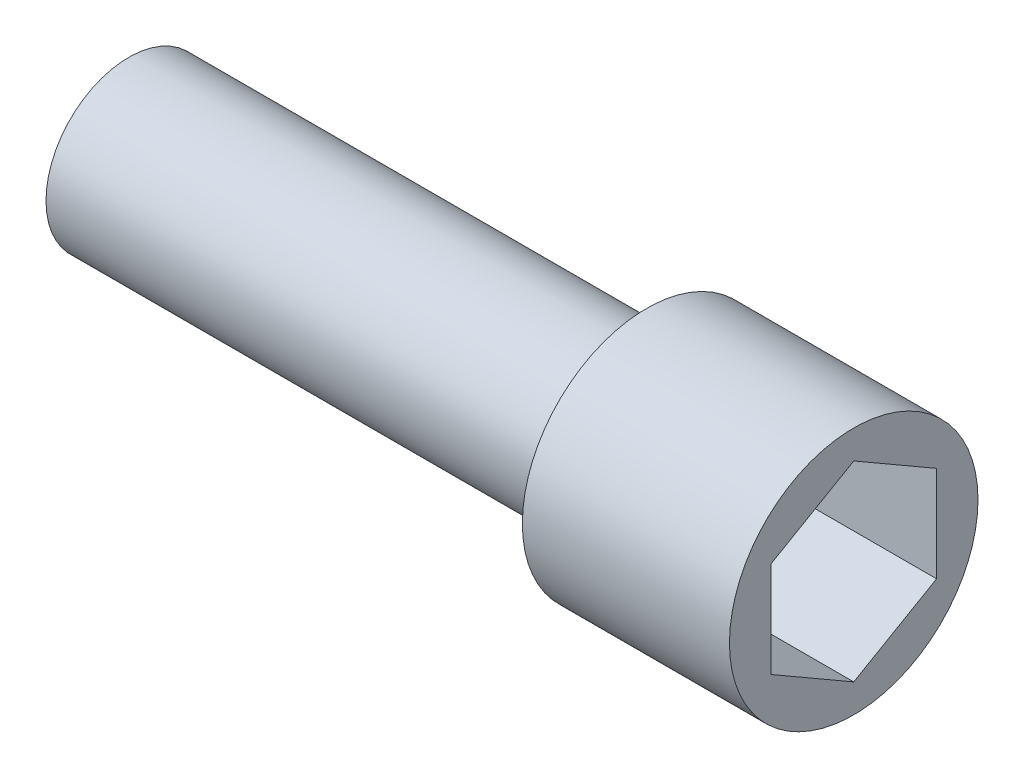
ISO-10303-21;
HEADER;
FILE_DESCRIPTION(('STEP AP214'),'2;1');
FILE_NAME('part.step','',(''),(''),'','','');
FILE_SCHEMA(('AUTOMOTIVE_DESIGN { 1 0 10303 214 1 1 1 1 }'));
ENDSEC;
DATA;
#1=APPLICATION_CONTEXT('core data for automotive mechanical design processes');
#2=APPLICATION_PROTOCOL_DEFINITION('international standard','automotive_design',2000,#1);
#3=PRODUCT_CONTEXT('',#1,'mechanical');
#4=PRODUCT('Part','Part','',(#3));
#5=PRODUCT_RELATED_PRODUCT_CATEGORY('part','',(#4));
#6=PRODUCT_DEFINITION_FORMATION('','',#4);
#7=PRODUCT_DEFINITION_CONTEXT('part definition',#1,'design');
#8=PRODUCT_DEFINITION('design','',#6,#7);
#9=PRODUCT_DEFINITION_SHAPE('','',#8);
#10=(LENGTH_UNIT() NAMED_UNIT(*) SI_UNIT(.MILLI.,.METRE.));
#11=(NAMED_UNIT(*) PLANE_ANGLE_UNIT() SI_UNIT($,.RADIAN.));
#12=(NAMED_UNIT(*) SI_UNIT($,.STERADIAN.) SOLID_ANGLE_UNIT());
#13=UNCERTAINTY_MEASURE_WITH_UNIT(LENGTH_MEASURE(1.E-05),#10,'distance_accuracy_value','');
#14=(GEOMETRIC_REPRESENTATION_CONTEXT(3) GLOBAL_UNCERTAINTY_ASSIGNED_CONTEXT((#13)) GLOBAL_UNIT_ASSIGNED_CONTEXT((#10,
#11,#12)) REPRESENTATION_CONTEXT('',''));
#15=CARTESIAN_POINT('',(0.,0.,0.));
#16=DIRECTION('',(0.,0.,1.));
#17=DIRECTION('',(1.,0.,0.));
#18=AXIS2_PLACEMENT_3D('',#15,#16,#17);
#19=CARTESIAN_POINT('',(10.,0.,0.));
#20=DIRECTION('',(-1.,0.,0.));
#21=DIRECTION('',(0.,0.,1.));
#22=AXIS2_PLACEMENT_3D('',#19,#20,#21);
#23=CYLINDRICAL_SURFACE('',#22,6.);
#24=CARTESIAN_POINT('',(10.,0.,0.));
#25=DIRECTION('',(1.,0.,0.));
#26=DIRECTION('',(0.,0.,-1.));
#27=AXIS2_PLACEMENT_3D('',#24,#25,#26);
#28=CIRCLE('',#27,6.);
#29=CARTESIAN_POINT('',(10.,0.,-6.));
#30=VERTEX_POINT('',#29);
#31=EDGE_CURVE('E54',#30,#30,#28,.T.);
#32=ORIENTED_EDGE('',*,*,#31,.F.);
#33=EDGE_LOOP('',(#32));
#34=FACE_BOUND('',#33,.T.);
#35=CARTESIAN_POINT('',(0.,0.,0.));
#36=DIRECTION('',(1.,0.,0.));
#37=DIRECTION('',(0.,0.,-1.));
#38=AXIS2_PLACEMENT_3D('',#35,#36,#37);
#39=CIRCLE('',#38,6.);
#40=CARTESIAN_POINT('',(0.,0.,-6.));
#41=VERTEX_POINT('',#40);
#42=EDGE_CURVE('E48',#41,#41,#39,.T.);
#43=ORIENTED_EDGE('',*,*,#42,.T.);
#44=EDGE_LOOP('',(#43));
#45=FACE_BOUND('',#44,.T.);
#46=ADVANCED_FACE('F45',(#34,#45),#23,.T.);
#47=CARTESIAN_POINT('',(10.,0.,0.));
#48=DIRECTION('',(1.,0.,0.));
#49=DIRECTION('',(0.,0.,-1.));
#50=AXIS2_PLACEMENT_3D('',#47,#48,#49);
#51=PLANE('',#50);
#52=DIRECTION('',(0.,0.5,0.866025403784439));
#53=VECTOR('',#52,1.);
#54=CARTESIAN_POINT('',(10.,2.3094010767585,-4.));
#55=LINE('',#54,#53);
#56=CARTESIAN_POINT('',(10.,2.3094010767585,-4.));
#57=VERTEX_POINT('',#56);
#58=CARTESIAN_POINT('',(10.,4.61880215351701,0.));
#59=VERTEX_POINT('',#58);
#60=EDGE_CURVE('E62',#57,#59,#55,.T.);
#61=ORIENTED_EDGE('',*,*,#60,.F.);
#62=DIRECTION('',(0.,1.,0.));
#63=VECTOR('',#62,1.);
#64=CARTESIAN_POINT('',(10.,-2.3094010767585,-4.));
#65=LINE('',#64,#63);
#66=CARTESIAN_POINT('',(10.,-2.3094010767585,-4.));
#67=VERTEX_POINT('',#66);
#68=EDGE_CURVE('E156',#67,#57,#65,.T.);
#69=ORIENTED_EDGE('',*,*,#68,.F.);
#70=DIRECTION('',(0.,0.5,-0.866025403784438));
#71=VECTOR('',#70,1.);
#72=CARTESIAN_POINT('',(10.,-4.61880215351701,0.));
#73=LINE('',#72,#71);
#74=CARTESIAN_POINT('',(10.,-4.61880215351701,0.));
#75=VERTEX_POINT('',#74);
#76=EDGE_CURVE('E153',#75,#67,#73,.T.);
#77=ORIENTED_EDGE('',*,*,#76,.F.);
#78=DIRECTION('',(0.,-0.5,-0.866025403784439));
#79=VECTOR('',#78,1.);
#80=CARTESIAN_POINT('',(10.,-2.3094010767585,4.));
#81=LINE('',#80,#79);
#82=CARTESIAN_POINT('',(10.,-2.3094010767585,4.));
#83=VERTEX_POINT('',#82);
#84=EDGE_CURVE('E110',#83,#75,#81,.T.);
#85=ORIENTED_EDGE('',*,*,#84,.F.);
#86=DIRECTION('',(0.,-1.,0.));
#87=VECTOR('',#86,1.);
#88=CARTESIAN_POINT('',(10.,2.3094010767585,4.));
#89=LINE('',#88,#87);
#90=CARTESIAN_POINT('',(10.,2.3094010767585,4.));
#91=VERTEX_POINT('',#90);
#92=EDGE_CURVE('E147',#91,#83,#89,.T.);
#93=ORIENTED_EDGE('',*,*,#92,.F.);
#94=DIRECTION('',(0.,-0.5,0.866025403784438));
#95=VECTOR('',#94,1.);
#96=CARTESIAN_POINT('',(10.,4.61880215351701,0.));
#97=LINE('',#96,#95);
#98=EDGE_CURVE('E142',#59,#91,#97,.T.);
#99=ORIENTED_EDGE('',*,*,#98,.F.);
#100=EDGE_LOOP('',(#61,#69,#77,#85,#93,#99));
#101=FACE_BOUND('',#100,.T.);
#102=ORIENTED_EDGE('',*,*,#31,.T.);
#103=EDGE_LOOP('',(#102));
#104=FACE_BOUND('',#103,.T.);
#105=ADVANCED_FACE('F182',(#101,#104),#51,.T.);
#106=CARTESIAN_POINT('',(0.,0.,0.));
#107=DIRECTION('',(1.,0.,0.));
#108=DIRECTION('',(0.,0.,-1.));
#109=AXIS2_PLACEMENT_3D('',#106,#107,#108);
#110=PLANE('',#109);
#111=CARTESIAN_POINT('',(0.,0.,0.));
#112=DIRECTION('',(-1.,0.,0.));
#113=DIRECTION('',(0.,0.,1.));
#114=AXIS2_PLACEMENT_3D('',#111,#112,#113);
#115=CIRCLE('',#114,4.);
#116=CARTESIAN_POINT('',(0.,0.,4.));
#117=VERTEX_POINT('',#116);
#118=EDGE_CURVE('E11',#117,#117,#115,.T.);
#119=ORIENTED_EDGE('',*,*,#118,.F.);
#120=EDGE_LOOP('',(#119));
#121=FACE_BOUND('',#120,.T.);
#122=ORIENTED_EDGE('',*,*,#42,.F.);
#123=EDGE_LOOP('',(#122));
#124=FACE_BOUND('',#123,.T.);
#125=ADVANCED_FACE('F179',(#121,#124),#110,.F.);
#126=CARTESIAN_POINT('',(3.,2.3094010767585,-4.));
#127=DIRECTION('',(0.,0.866025403784439,-0.5));
#128=DIRECTION('',(0.,0.5,0.866025403784439));
#129=AXIS2_PLACEMENT_3D('',#126,#127,#128);
#130=PLANE('',#129);
#131=ORIENTED_EDGE('',*,*,#60,.T.);
#132=DIRECTION('',(1.,0.,0.));
#133=VECTOR('',#132,1.);
#134=CARTESIAN_POINT('',(3.,4.61880215351701,0.));
#135=LINE('',#134,#133);
#136=CARTESIAN_POINT('',(3.,4.61880215351701,0.));
#137=VERTEX_POINT('',#136);
#138=EDGE_CURVE('E92',#137,#59,#135,.T.);
#139=ORIENTED_EDGE('',*,*,#138,.F.);
#140=DIRECTION('',(0.,0.5,0.866025403784439));
#141=VECTOR('',#140,1.);
#142=CARTESIAN_POINT('',(3.,2.3094010767585,-4.));
#143=LINE('',#142,#141);
#144=CARTESIAN_POINT('',(3.,2.3094010767585,-4.));
#145=VERTEX_POINT('',#144);
#146=EDGE_CURVE('E159',#145,#137,#143,.T.);
#147=ORIENTED_EDGE('',*,*,#146,.F.);
#148=DIRECTION('',(1.,0.,0.));
#149=VECTOR('',#148,1.);
#150=CARTESIAN_POINT('',(3.,2.3094010767585,-4.));
#151=LINE('',#150,#149);
#152=EDGE_CURVE('E70',#145,#57,#151,.T.);
#153=ORIENTED_EDGE('',*,*,#152,.T.);
#154=EDGE_LOOP('',(#131,#139,#147,#153));
#155=FACE_BOUND('',#154,.T.);
#156=ADVANCED_FACE('F181',(#155),#130,.F.);
#157=CARTESIAN_POINT('',(3.,-2.3094010767585,-4.));
#158=DIRECTION('',(0.,0.,-1.));
#159=DIRECTION('',(-1.,0.,0.));
#160=AXIS2_PLACEMENT_3D('',#157,#158,#159);
#161=PLANE('',#160);
#162=ORIENTED_EDGE('',*,*,#68,.T.);
#163=ORIENTED_EDGE('',*,*,#152,.F.);
#164=DIRECTION('',(0.,1.,0.));
#165=VECTOR('',#164,1.);
#166=CARTESIAN_POINT('',(3.,-2.3094010767585,-4.));
#167=LINE('',#166,#165);
#168=CARTESIAN_POINT('',(3.,-2.3094010767585,-4.));
#169=VERTEX_POINT('',#168);
#170=EDGE_CURVE('E124',#169,#145,#167,.T.);
#171=ORIENTED_EDGE('',*,*,#170,.F.);
#172=DIRECTION('',(1.,0.,0.));
#173=VECTOR('',#172,1.);
#174=CARTESIAN_POINT('',(3.,-2.3094010767585,-4.));
#175=LINE('',#174,#173);
#176=EDGE_CURVE('E115',#169,#67,#175,.T.);
#177=ORIENTED_EDGE('',*,*,#176,.T.);
#178=EDGE_LOOP('',(#162,#163,#171,#177));
#179=FACE_BOUND('',#178,.T.);
#180=ADVANCED_FACE('F189',(#179),#161,.F.);
#181=CARTESIAN_POINT('',(3.,-4.61880215351701,0.));
#182=DIRECTION('',(0.,-0.866025403784438,-0.5));
#183=DIRECTION('',(0.,0.5,-0.866025403784439));
#184=AXIS2_PLACEMENT_3D('',#181,#182,#183);
#185=PLANE('',#184);
#186=ORIENTED_EDGE('',*,*,#76,.T.);
#187=ORIENTED_EDGE('',*,*,#176,.F.);
#188=DIRECTION('',(0.,0.5,-0.866025403784438));
#189=VECTOR('',#188,1.);
#190=CARTESIAN_POINT('',(3.,-4.61880215351701,0.));
#191=LINE('',#190,#189);
#192=CARTESIAN_POINT('',(3.,-4.61880215351701,0.));
#193=VERTEX_POINT('',#192);
#194=EDGE_CURVE('E119',#193,#169,#191,.T.);
#195=ORIENTED_EDGE('',*,*,#194,.F.);
#196=DIRECTION('',(1.,0.,0.));
#197=VECTOR('',#196,1.);
#198=CARTESIAN_POINT('',(3.,-4.61880215351701,0.));
#199=LINE('',#198,#197);
#200=EDGE_CURVE('E103',#193,#75,#199,.T.);
#201=ORIENTED_EDGE('',*,*,#200,.T.);
#202=EDGE_LOOP('',(#186,#187,#195,#201));
#203=FACE_BOUND('',#202,.T.);
#204=ADVANCED_FACE('F120',(#203),#185,.F.);
#205=CARTESIAN_POINT('',(3.,-2.3094010767585,4.));
#206=DIRECTION('',(0.,-0.866025403784439,0.5));
#207=DIRECTION('',(0.,-0.5,-0.866025403784439));
#208=AXIS2_PLACEMENT_3D('',#205,#206,#207);
#209=PLANE('',#208);
#210=ORIENTED_EDGE('',*,*,#84,.T.);
#211=ORIENTED_EDGE('',*,*,#200,.F.);
#212=DIRECTION('',(0.,-0.5,-0.866025403784439));
#213=VECTOR('',#212,1.);
#214=CARTESIAN_POINT('',(3.,-2.3094010767585,4.));
#215=LINE('',#214,#213);
#216=CARTESIAN_POINT('',(3.,-2.3094010767585,4.));
#217=VERTEX_POINT('',#216);
#218=EDGE_CURVE('E107',#217,#193,#215,.T.);
#219=ORIENTED_EDGE('',*,*,#218,.F.);
#220=DIRECTION('',(1.,0.,0.));
#221=VECTOR('',#220,1.);
#222=CARTESIAN_POINT('',(3.,-2.3094010767585,4.));
#223=LINE('',#222,#221);
#224=EDGE_CURVE('E116',#217,#83,#223,.T.);
#225=ORIENTED_EDGE('',*,*,#224,.T.);
#226=EDGE_LOOP('',(#210,#211,#219,#225));
#227=FACE_BOUND('',#226,.T.);
#228=ADVANCED_FACE('F105',(#227),#209,.F.);
#229=CARTESIAN_POINT('',(3.,2.3094010767585,4.));
#230=DIRECTION('',(0.,0.,1.));
#231=DIRECTION('',(1.,0.,0.));
#232=AXIS2_PLACEMENT_3D('',#229,#230,#231);
#233=PLANE('',#232);
#234=ORIENTED_EDGE('',*,*,#92,.T.);
#235=ORIENTED_EDGE('',*,*,#224,.F.);
#236=DIRECTION('',(0.,-1.,0.));
#237=VECTOR('',#236,1.);
#238=CARTESIAN_POINT('',(3.,2.3094010767585,4.));
#239=LINE('',#238,#237);
#240=CARTESIAN_POINT('',(3.,2.3094010767585,4.));
#241=VERTEX_POINT('',#240);
#242=EDGE_CURVE('E130',#241,#217,#239,.T.);
#243=ORIENTED_EDGE('',*,*,#242,.F.);
#244=DIRECTION('',(1.,0.,0.));
#245=VECTOR('',#244,1.);
#246=CARTESIAN_POINT('',(3.,2.3094010767585,4.));
#247=LINE('',#246,#245);
#248=EDGE_CURVE('E166',#241,#91,#247,.T.);
#249=ORIENTED_EDGE('',*,*,#248,.T.);
#250=EDGE_LOOP('',(#234,#235,#243,#249));
#251=FACE_BOUND('',#250,.T.);
#252=ADVANCED_FACE('F230',(#251),#233,.F.);
#253=CARTESIAN_POINT('',(3.,4.61880215351701,0.));
#254=DIRECTION('',(0.,0.866025403784438,0.5));
#255=DIRECTION('',(0.,-0.5,0.866025403784438));
#256=AXIS2_PLACEMENT_3D('',#253,#254,#255);
#257=PLANE('',#256);
#258=ORIENTED_EDGE('',*,*,#98,.T.);
#259=ORIENTED_EDGE('',*,*,#248,.F.);
#260=DIRECTION('',(0.,-0.5,0.866025403784438));
#261=VECTOR('',#260,1.);
#262=CARTESIAN_POINT('',(3.,4.61880215351701,0.));
#263=LINE('',#262,#261);
#264=EDGE_CURVE('E134',#137,#241,#263,.T.);
#265=ORIENTED_EDGE('',*,*,#264,.F.);
#266=ORIENTED_EDGE('',*,*,#138,.T.);
#267=EDGE_LOOP('',(#258,#259,#265,#266));
#268=FACE_BOUND('',#267,.T.);
#269=ADVANCED_FACE('F238',(#268),#257,.F.);
#270=CARTESIAN_POINT('',(3.,0.,0.));
#271=DIRECTION('',(1.,0.,0.));
#272=DIRECTION('',(0.,0.,-1.));
#273=AXIS2_PLACEMENT_3D('',#270,#271,#272);
#274=PLANE('',#273);
#275=ORIENTED_EDGE('',*,*,#146,.T.);
#276=ORIENTED_EDGE('',*,*,#264,.T.);
#277=ORIENTED_EDGE('',*,*,#242,.T.);
#278=ORIENTED_EDGE('',*,*,#218,.T.);
#279=ORIENTED_EDGE('',*,*,#194,.T.);
#280=ORIENTED_EDGE('',*,*,#170,.T.);
#281=EDGE_LOOP('',(#275,#276,#277,#278,#279,#280));
#282=FACE_BOUND('',#281,.T.);
#283=ADVANCED_FACE('F127',(#282),#274,.T.);
#284=CARTESIAN_POINT('',(-25.,0.,0.));
#285=DIRECTION('',(1.,0.,0.));
#286=DIRECTION('',(0.,0.,-1.));
#287=AXIS2_PLACEMENT_3D('',#284,#285,#286);
#288=CYLINDRICAL_SURFACE('',#287,4.);
#289=CARTESIAN_POINT('',(-25.,0.,0.));
#290=DIRECTION('',(-1.,0.,0.));
#291=DIRECTION('',(0.,0.,1.));
#292=AXIS2_PLACEMENT_3D('',#289,#290,#291);
#293=CIRCLE('',#292,4.);
#294=CARTESIAN_POINT('',(-25.,0.,4.));
#295=VERTEX_POINT('',#294);
#296=EDGE_CURVE('E143',#295,#295,#293,.T.);
#297=ORIENTED_EDGE('',*,*,#296,.F.);
#298=EDGE_LOOP('',(#297));
#299=FACE_BOUND('',#298,.T.);
#300=ORIENTED_EDGE('',*,*,#118,.T.);
#301=EDGE_LOOP('',(#300));
#302=FACE_BOUND('',#301,.T.);
#303=ADVANCED_FACE('F253',(#299,#302),#288,.T.);
#304=CARTESIAN_POINT('',(-25.,0.,0.));
#305=DIRECTION('',(-1.,0.,0.));
#306=DIRECTION('',(0.,0.,1.));
#307=AXIS2_PLACEMENT_3D('',#304,#305,#306);
#308=PLANE('',#307);
#309=ORIENTED_EDGE('',*,*,#296,.T.);
#310=EDGE_LOOP('',(#309));
#311=FACE_BOUND('',#310,.T.);
#312=ADVANCED_FACE('F264',(#311),#308,.T.);
#313=CLOSED_SHELL('',(#46,#105,#125,#156,#180,#204,#228,#252,#269,#283,#303,#312));
#314=MANIFOLD_SOLID_BREP('B2',#313);
#315=ADVANCED_BREP_SHAPE_REPRESENTATION('',(#18,#314),#14);
#316=SHAPE_DEFINITION_REPRESENTATION(#9,#315);
ENDSEC;
END-ISO-10303-21;
